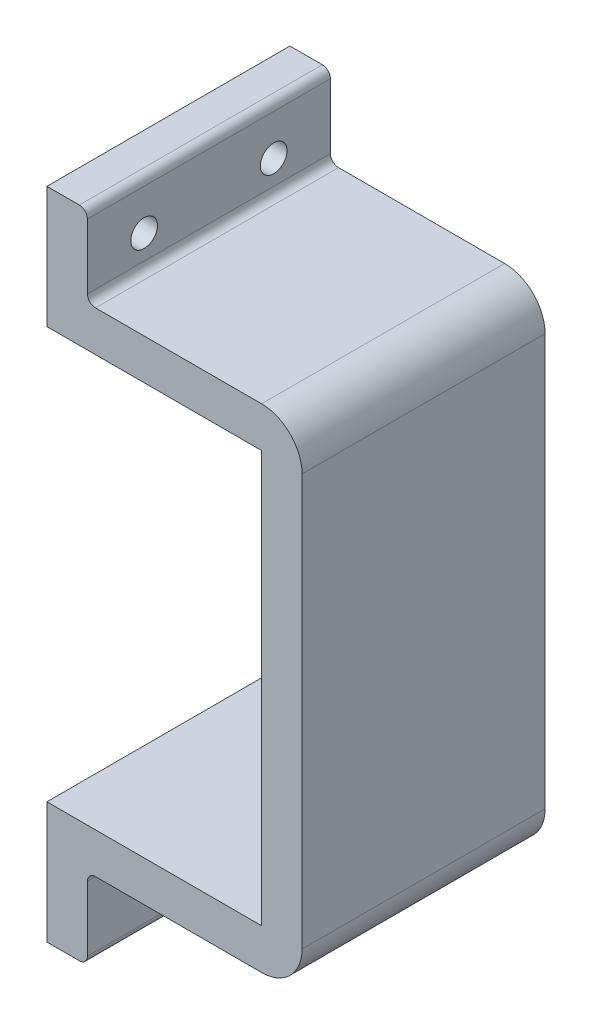
ISO-10303-21;
HEADER;
FILE_DESCRIPTION(('STEP AP214'),'2;1');
FILE_NAME('part.step','',(''),(''),'','','');
FILE_SCHEMA(('AUTOMOTIVE_DESIGN { 1 0 10303 214 1 1 1 1 }'));
ENDSEC;
DATA;
#1=APPLICATION_CONTEXT('core data for automotive mechanical design processes');
#2=APPLICATION_PROTOCOL_DEFINITION('international standard','automotive_design',2000,#1);
#3=PRODUCT_CONTEXT('',#1,'mechanical');
#4=PRODUCT('Part','Part','',(#3));
#5=PRODUCT_RELATED_PRODUCT_CATEGORY('part','',(#4));
#6=PRODUCT_DEFINITION_FORMATION('','',#4);
#7=PRODUCT_DEFINITION_CONTEXT('part definition',#1,'design');
#8=PRODUCT_DEFINITION('design','',#6,#7);
#9=PRODUCT_DEFINITION_SHAPE('','',#8);
#10=(LENGTH_UNIT() NAMED_UNIT(*) SI_UNIT(.MILLI.,.METRE.));
#11=(NAMED_UNIT(*) PLANE_ANGLE_UNIT() SI_UNIT($,.RADIAN.));
#12=(NAMED_UNIT(*) SI_UNIT($,.STERADIAN.) SOLID_ANGLE_UNIT());
#13=UNCERTAINTY_MEASURE_WITH_UNIT(LENGTH_MEASURE(1.E-05),#10,'distance_accuracy_value','');
#14=(GEOMETRIC_REPRESENTATION_CONTEXT(3) GLOBAL_UNCERTAINTY_ASSIGNED_CONTEXT((#13)) GLOBAL_UNIT_ASSIGNED_CONTEXT((#10,
#11,#12)) REPRESENTATION_CONTEXT('',''));
#15=CARTESIAN_POINT('',(0.,0.,0.));
#16=DIRECTION('',(0.,0.,1.));
#17=DIRECTION('',(1.,0.,0.));
#18=AXIS2_PLACEMENT_3D('',#15,#16,#17);
#19=CARTESIAN_POINT('',(-13.25,0.,30.));
#20=DIRECTION('',(-1.,0.,0.));
#21=DIRECTION('',(0.,0.,1.));
#22=AXIS2_PLACEMENT_3D('',#19,#20,#21);
#23=PLANE('',#22);
#24=CARTESIAN_POINT('',(-13.25,-34.4,7.));
#25=DIRECTION('',(-1.,0.,0.));
#26=DIRECTION('',(0.,0.,1.));
#27=AXIS2_PLACEMENT_3D('',#24,#25,#26);
#28=CIRCLE('',#27,1.65);
#29=CARTESIAN_POINT('',(-13.25,-34.4,8.65));
#30=VERTEX_POINT('',#29);
#31=EDGE_CURVE('E505',#30,#30,#28,.T.);
#32=ORIENTED_EDGE('',*,*,#31,.F.);
#33=EDGE_LOOP('',(#32));
#34=FACE_BOUND('',#33,.T.);
#35=CARTESIAN_POINT('',(-13.25,-34.4,23.));
#36=DIRECTION('',(-1.,0.,0.));
#37=DIRECTION('',(0.,0.,1.));
#38=AXIS2_PLACEMENT_3D('',#35,#36,#37);
#39=CIRCLE('',#38,1.65);
#40=CARTESIAN_POINT('',(-13.25,-34.4,24.65));
#41=VERTEX_POINT('',#40);
#42=EDGE_CURVE('E503',#41,#41,#39,.T.);
#43=ORIENTED_EDGE('',*,*,#42,.F.);
#44=EDGE_LOOP('',(#43));
#45=FACE_BOUND('',#44,.T.);
#46=DIRECTION('',(0.,1.,0.));
#47=VECTOR('',#46,1.);
#48=CARTESIAN_POINT('',(-13.25,0.,0.));
#49=LINE('',#48,#47);
#50=CARTESIAN_POINT('',(-13.25,-40.4,0.));
#51=VERTEX_POINT('',#50);
#52=CARTESIAN_POINT('',(-13.25,-25.4,0.));
#53=VERTEX_POINT('',#52);
#54=EDGE_CURVE('E188',#51,#53,#49,.T.);
#55=ORIENTED_EDGE('',*,*,#54,.F.);
#56=DIRECTION('',(0.,0.,-1.));
#57=VECTOR('',#56,1.);
#58=CARTESIAN_POINT('',(-13.25,-40.4,30.));
#59=LINE('',#58,#57);
#60=CARTESIAN_POINT('',(-13.25,-40.4,30.));
#61=VERTEX_POINT('',#60);
#62=EDGE_CURVE('E174',#61,#51,#59,.T.);
#63=ORIENTED_EDGE('',*,*,#62,.F.);
#64=DIRECTION('',(0.,1.,0.));
#65=VECTOR('',#64,1.);
#66=CARTESIAN_POINT('',(-13.25,0.,30.));
#67=LINE('',#66,#65);
#68=CARTESIAN_POINT('',(-13.25,-25.4,30.));
#69=VERTEX_POINT('',#68);
#70=EDGE_CURVE('E182',#61,#69,#67,.T.);
#71=ORIENTED_EDGE('',*,*,#70,.T.);
#72=DIRECTION('',(0.,0.,-1.));
#73=VECTOR('',#72,1.);
#74=CARTESIAN_POINT('',(-13.25,-25.4,30.));
#75=LINE('',#74,#73);
#76=EDGE_CURVE('E239',#69,#53,#75,.T.);
#77=ORIENTED_EDGE('',*,*,#76,.T.);
#78=EDGE_LOOP('',(#55,#63,#71,#77));
#79=FACE_BOUND('',#78,.T.);
#80=ADVANCED_FACE('F44',(#34,#45,#79),#23,.T.);
#81=CARTESIAN_POINT('',(0.,-40.4,30.));
#82=DIRECTION('',(0.,-1.,0.));
#83=DIRECTION('',(0.,0.,-1.));
#84=AXIS2_PLACEMENT_3D('',#81,#82,#83);
#85=PLANE('',#84);
#86=DIRECTION('',(-1.,0.,0.));
#87=VECTOR('',#86,1.);
#88=CARTESIAN_POINT('',(0.,-40.4,0.));
#89=LINE('',#88,#87);
#90=CARTESIAN_POINT('',(-9.24999999999999,-40.4,0.));
#91=VERTEX_POINT('',#90);
#92=EDGE_CURVE('E242',#91,#51,#89,.T.);
#93=ORIENTED_EDGE('',*,*,#92,.F.);
#94=DIRECTION('',(0.,0.,-1.));
#95=VECTOR('',#94,1.);
#96=CARTESIAN_POINT('',(-9.24999999999999,-40.4,30.));
#97=LINE('',#96,#95);
#98=CARTESIAN_POINT('',(-9.24999999999999,-40.4,30.));
#99=VERTEX_POINT('',#98);
#100=EDGE_CURVE('E177',#91,#99,#97,.F.);
#101=ORIENTED_EDGE('',*,*,#100,.T.);
#102=DIRECTION('',(-1.,0.,0.));
#103=VECTOR('',#102,1.);
#104=CARTESIAN_POINT('',(0.,-40.4,30.));
#105=LINE('',#104,#103);
#106=EDGE_CURVE('E170',#99,#61,#105,.T.);
#107=ORIENTED_EDGE('',*,*,#106,.T.);
#108=ORIENTED_EDGE('',*,*,#62,.T.);
#109=EDGE_LOOP('',(#93,#101,#107,#108));
#110=FACE_BOUND('',#109,.T.);
#111=ADVANCED_FACE('F173',(#110),#85,.T.);
#112=CARTESIAN_POINT('',(-8.25,0.,30.));
#113=DIRECTION('',(1.,0.,0.));
#114=DIRECTION('',(0.,1.,0.));
#115=AXIS2_PLACEMENT_3D('',#112,#113,#114);
#116=PLANE('',#115);
#117=CARTESIAN_POINT('',(-8.24999999999999,-34.4,7.));
#118=DIRECTION('',(1.,0.,0.));
#119=DIRECTION('',(0.,1.,0.));
#120=AXIS2_PLACEMENT_3D('',#117,#118,#119);
#121=CIRCLE('',#120,1.65);
#122=CARTESIAN_POINT('',(-8.24999999999999,-32.75,7.));
#123=VERTEX_POINT('',#122);
#124=EDGE_CURVE('E243',#123,#123,#121,.T.);
#125=ORIENTED_EDGE('',*,*,#124,.F.);
#126=EDGE_LOOP('',(#125));
#127=FACE_BOUND('',#126,.T.);
#128=CARTESIAN_POINT('',(-8.24999999999999,-34.4,23.));
#129=DIRECTION('',(1.,0.,0.));
#130=DIRECTION('',(0.,1.,0.));
#131=AXIS2_PLACEMENT_3D('',#128,#129,#130);
#132=CIRCLE('',#131,1.65);
#133=CARTESIAN_POINT('',(-8.24999999999999,-32.75,23.));
#134=VERTEX_POINT('',#133);
#135=EDGE_CURVE('E293',#134,#134,#132,.T.);
#136=ORIENTED_EDGE('',*,*,#135,.F.);
#137=EDGE_LOOP('',(#136));
#138=FACE_BOUND('',#137,.T.);
#139=DIRECTION('',(0.,-1.,0.));
#140=VECTOR('',#139,1.);
#141=CARTESIAN_POINT('',(-8.25,0.,0.));
#142=LINE('',#141,#140);
#143=CARTESIAN_POINT('',(-8.24999999999999,-31.4,0.));
#144=VERTEX_POINT('',#143);
#145=CARTESIAN_POINT('',(-8.24999999999999,-39.4,0.));
#146=VERTEX_POINT('',#145);
#147=EDGE_CURVE('E246',#144,#146,#142,.T.);
#148=ORIENTED_EDGE('',*,*,#147,.F.);
#149=DIRECTION('',(0.,0.,-1.));
#150=VECTOR('',#149,1.);
#151=CARTESIAN_POINT('',(-8.24999999999999,-31.4,30.));
#152=LINE('',#151,#150);
#153=CARTESIAN_POINT('',(-8.24999999999999,-31.4,30.));
#154=VERTEX_POINT('',#153);
#155=EDGE_CURVE('E334',#144,#154,#152,.F.);
#156=ORIENTED_EDGE('',*,*,#155,.T.);
#157=DIRECTION('',(0.,-1.,0.));
#158=VECTOR('',#157,1.);
#159=CARTESIAN_POINT('',(-8.25,0.,30.));
#160=LINE('',#159,#158);
#161=CARTESIAN_POINT('',(-8.24999999999999,-39.4,30.));
#162=VERTEX_POINT('',#161);
#163=EDGE_CURVE('E181',#154,#162,#160,.T.);
#164=ORIENTED_EDGE('',*,*,#163,.T.);
#165=DIRECTION('',(0.,0.,-1.));
#166=VECTOR('',#165,1.);
#167=CARTESIAN_POINT('',(-8.24999999999999,-39.4,30.));
#168=LINE('',#167,#166);
#169=EDGE_CURVE('E330',#162,#146,#168,.T.);
#170=ORIENTED_EDGE('',*,*,#169,.T.);
#171=EDGE_LOOP('',(#148,#156,#164,#170));
#172=FACE_BOUND('',#171,.T.);
#173=ADVANCED_FACE('F414',(#127,#138,#172),#116,.T.);
#174=CARTESIAN_POINT('',(0.,-30.4,30.));
#175=DIRECTION('',(0.,-1.,0.));
#176=DIRECTION('',(1.,0.,0.));
#177=AXIS2_PLACEMENT_3D('',#174,#175,#176);
#178=PLANE('',#177);
#179=DIRECTION('',(-1.,0.,0.));
#180=VECTOR('',#179,1.);
#181=CARTESIAN_POINT('',(0.,-30.4,30.));
#182=LINE('',#181,#180);
#183=CARTESIAN_POINT('',(13.25,-30.4,30.));
#184=VERTEX_POINT('',#183);
#185=CARTESIAN_POINT('',(-7.25,-30.4,30.));
#186=VERTEX_POINT('',#185);
#187=EDGE_CURVE('E210',#184,#186,#182,.T.);
#188=ORIENTED_EDGE('',*,*,#187,.T.);
#189=DIRECTION('',(0.,0.,-1.));
#190=VECTOR('',#189,1.);
#191=CARTESIAN_POINT('',(-7.25,-30.4,0.));
#192=LINE('',#191,#190);
#193=CARTESIAN_POINT('',(-7.25,-30.4,0.));
#194=VERTEX_POINT('',#193);
#195=EDGE_CURVE('E326',#186,#194,#192,.T.);
#196=ORIENTED_EDGE('',*,*,#195,.T.);
#197=DIRECTION('',(-1.,0.,0.));
#198=VECTOR('',#197,1.);
#199=CARTESIAN_POINT('',(0.,-30.4,0.));
#200=LINE('',#199,#198);
#201=CARTESIAN_POINT('',(13.25,-30.4,0.));
#202=VERTEX_POINT('',#201);
#203=EDGE_CURVE('E250',#202,#194,#200,.T.);
#204=ORIENTED_EDGE('',*,*,#203,.F.);
#205=DIRECTION('',(0.,0.,-1.));
#206=VECTOR('',#205,1.);
#207=CARTESIAN_POINT('',(13.25,-30.4,30.));
#208=LINE('',#207,#206);
#209=EDGE_CURVE('E312',#202,#184,#208,.F.);
#210=ORIENTED_EDGE('',*,*,#209,.T.);
#211=EDGE_LOOP('',(#188,#196,#204,#210));
#212=FACE_BOUND('',#211,.T.);
#213=ADVANCED_FACE('F422',(#212),#178,.T.);
#214=CARTESIAN_POINT('',(18.25,0.,30.));
#215=DIRECTION('',(1.,0.,0.));
#216=DIRECTION('',(0.,1.,0.));
#217=AXIS2_PLACEMENT_3D('',#214,#215,#216);
#218=PLANE('',#217);
#219=DIRECTION('',(0.,-1.,0.));
#220=VECTOR('',#219,1.);
#221=CARTESIAN_POINT('',(18.25,0.,30.));
#222=LINE('',#221,#220);
#223=CARTESIAN_POINT('',(18.25,25.4,30.));
#224=VERTEX_POINT('',#223);
#225=CARTESIAN_POINT('',(18.25,-25.4,30.));
#226=VERTEX_POINT('',#225);
#227=EDGE_CURVE('E214',#224,#226,#222,.T.);
#228=ORIENTED_EDGE('',*,*,#227,.T.);
#229=DIRECTION('',(0.,0.,-1.));
#230=VECTOR('',#229,1.);
#231=CARTESIAN_POINT('',(18.25,-25.4,30.));
#232=LINE('',#231,#230);
#233=CARTESIAN_POINT('',(18.25,-25.4,0.));
#234=VERTEX_POINT('',#233);
#235=EDGE_CURVE('E302',#226,#234,#232,.T.);
#236=ORIENTED_EDGE('',*,*,#235,.T.);
#237=DIRECTION('',(0.,-1.,0.));
#238=VECTOR('',#237,1.);
#239=CARTESIAN_POINT('',(18.25,0.,0.));
#240=LINE('',#239,#238);
#241=CARTESIAN_POINT('',(18.25,25.4,0.));
#242=VERTEX_POINT('',#241);
#243=EDGE_CURVE('E254',#242,#234,#240,.T.);
#244=ORIENTED_EDGE('',*,*,#243,.F.);
#245=DIRECTION('',(0.,0.,-1.));
#246=VECTOR('',#245,1.);
#247=CARTESIAN_POINT('',(18.25,25.4,30.));
#248=LINE('',#247,#246);
#249=EDGE_CURVE('E190',#242,#224,#248,.F.);
#250=ORIENTED_EDGE('',*,*,#249,.T.);
#251=EDGE_LOOP('',(#228,#236,#244,#250));
#252=FACE_BOUND('',#251,.T.);
#253=ADVANCED_FACE('F431',(#252),#218,.T.);
#254=CARTESIAN_POINT('',(0.,30.4,30.));
#255=DIRECTION('',(0.,1.,0.));
#256=DIRECTION('',(0.,0.,1.));
#257=AXIS2_PLACEMENT_3D('',#254,#255,#256);
#258=PLANE('',#257);
#259=DIRECTION('',(1.,0.,0.));
#260=VECTOR('',#259,1.);
#261=CARTESIAN_POINT('',(0.,30.4,0.));
#262=LINE('',#261,#260);
#263=CARTESIAN_POINT('',(-7.25,30.4,0.));
#264=VERTEX_POINT('',#263);
#265=CARTESIAN_POINT('',(13.25,30.4,0.));
#266=VERTEX_POINT('',#265);
#267=EDGE_CURVE('E258',#264,#266,#262,.T.);
#268=ORIENTED_EDGE('',*,*,#267,.F.);
#269=DIRECTION('',(0.,0.,-1.));
#270=VECTOR('',#269,1.);
#271=CARTESIAN_POINT('',(-7.25,30.4,30.));
#272=LINE('',#271,#270);
#273=CARTESIAN_POINT('',(-7.25,30.4,30.));
#274=VERTEX_POINT('',#273);
#275=EDGE_CURVE('E357',#264,#274,#272,.F.);
#276=ORIENTED_EDGE('',*,*,#275,.T.);
#277=DIRECTION('',(1.,0.,0.));
#278=VECTOR('',#277,1.);
#279=CARTESIAN_POINT('',(0.,30.4,30.));
#280=LINE('',#279,#278);
#281=CARTESIAN_POINT('',(13.25,30.4,30.));
#282=VERTEX_POINT('',#281);
#283=EDGE_CURVE('E218',#274,#282,#280,.T.);
#284=ORIENTED_EDGE('',*,*,#283,.T.);
#285=DIRECTION('',(0.,0.,-1.));
#286=VECTOR('',#285,1.);
#287=CARTESIAN_POINT('',(13.25,30.4,30.));
#288=LINE('',#287,#286);
#289=EDGE_CURVE('E322',#282,#266,#288,.T.);
#290=ORIENTED_EDGE('',*,*,#289,.T.);
#291=EDGE_LOOP('',(#268,#276,#284,#290));
#292=FACE_BOUND('',#291,.T.);
#293=ADVANCED_FACE('F379',(#292),#258,.T.);
#294=CARTESIAN_POINT('',(-8.24999999999999,0.,30.));
#295=DIRECTION('',(1.,0.,0.));
#296=DIRECTION('',(0.,1.,0.));
#297=AXIS2_PLACEMENT_3D('',#294,#295,#296);
#298=PLANE('',#297);
#299=CARTESIAN_POINT('',(-8.25,34.4,23.));
#300=DIRECTION('',(1.,0.,0.));
#301=DIRECTION('',(0.,1.,0.));
#302=AXIS2_PLACEMENT_3D('',#299,#300,#301);
#303=CIRCLE('',#302,1.65);
#304=CARTESIAN_POINT('',(-8.25,36.05,23.));
#305=VERTEX_POINT('',#304);
#306=EDGE_CURVE('E204',#305,#305,#303,.T.);
#307=ORIENTED_EDGE('',*,*,#306,.F.);
#308=EDGE_LOOP('',(#307));
#309=FACE_BOUND('',#308,.T.);
#310=CARTESIAN_POINT('',(-8.25,34.4,7.));
#311=DIRECTION('',(1.,0.,0.));
#312=DIRECTION('',(0.,1.,0.));
#313=AXIS2_PLACEMENT_3D('',#310,#311,#312);
#314=CIRCLE('',#313,1.65);
#315=CARTESIAN_POINT('',(-8.25,36.05,7.));
#316=VERTEX_POINT('',#315);
#317=EDGE_CURVE('E518',#316,#316,#314,.T.);
#318=ORIENTED_EDGE('',*,*,#317,.F.);
#319=EDGE_LOOP('',(#318));
#320=FACE_BOUND('',#319,.T.);
#321=DIRECTION('',(0.,-1.,0.));
#322=VECTOR('',#321,1.);
#323=CARTESIAN_POINT('',(-8.24999999999999,0.,30.));
#324=LINE('',#323,#322);
#325=CARTESIAN_POINT('',(-8.25,39.4,30.));
#326=VERTEX_POINT('',#325);
#327=CARTESIAN_POINT('',(-8.25,31.4,30.));
#328=VERTEX_POINT('',#327);
#329=EDGE_CURVE('E221',#326,#328,#324,.T.);
#330=ORIENTED_EDGE('',*,*,#329,.T.);
#331=DIRECTION('',(0.,0.,-1.));
#332=VECTOR('',#331,1.);
#333=CARTESIAN_POINT('',(-8.25,31.4,0.));
#334=LINE('',#333,#332);
#335=CARTESIAN_POINT('',(-8.25,31.4,0.));
#336=VERTEX_POINT('',#335);
#337=EDGE_CURVE('E353',#328,#336,#334,.T.);
#338=ORIENTED_EDGE('',*,*,#337,.T.);
#339=DIRECTION('',(0.,-1.,0.));
#340=VECTOR('',#339,1.);
#341=CARTESIAN_POINT('',(-8.24999999999999,0.,0.));
#342=LINE('',#341,#340);
#343=CARTESIAN_POINT('',(-8.25,39.4,0.));
#344=VERTEX_POINT('',#343);
#345=EDGE_CURVE('E261',#344,#336,#342,.T.);
#346=ORIENTED_EDGE('',*,*,#345,.F.);
#347=DIRECTION('',(0.,0.,-1.));
#348=VECTOR('',#347,1.);
#349=CARTESIAN_POINT('',(-8.25,39.4,30.));
#350=LINE('',#349,#348);
#351=EDGE_CURVE('E350',#344,#326,#350,.F.);
#352=ORIENTED_EDGE('',*,*,#351,.T.);
#353=EDGE_LOOP('',(#330,#338,#346,#352));
#354=FACE_BOUND('',#353,.T.);
#355=ADVANCED_FACE('F383',(#309,#320,#354),#298,.T.);
#356=CARTESIAN_POINT('',(0.,40.4,30.));
#357=DIRECTION('',(0.,1.,0.));
#358=DIRECTION('',(0.,0.,1.));
#359=AXIS2_PLACEMENT_3D('',#356,#357,#358);
#360=PLANE('',#359);
#361=DIRECTION('',(1.,0.,0.));
#362=VECTOR('',#361,1.);
#363=CARTESIAN_POINT('',(0.,40.4,30.));
#364=LINE('',#363,#362);
#365=CARTESIAN_POINT('',(-13.25,40.4,30.));
#366=VERTEX_POINT('',#365);
#367=CARTESIAN_POINT('',(-9.25,40.4,30.));
#368=VERTEX_POINT('',#367);
#369=EDGE_CURVE('E224',#366,#368,#364,.T.);
#370=ORIENTED_EDGE('',*,*,#369,.T.);
#371=DIRECTION('',(0.,0.,-1.));
#372=VECTOR('',#371,1.);
#373=CARTESIAN_POINT('',(-9.25,40.4,30.));
#374=LINE('',#373,#372);
#375=CARTESIAN_POINT('',(-9.25,40.4,0.));
#376=VERTEX_POINT('',#375);
#377=EDGE_CURVE('E360',#368,#376,#374,.T.);
#378=ORIENTED_EDGE('',*,*,#377,.T.);
#379=DIRECTION('',(1.,0.,0.));
#380=VECTOR('',#379,1.);
#381=CARTESIAN_POINT('',(0.,40.4,0.));
#382=LINE('',#381,#380);
#383=CARTESIAN_POINT('',(-13.25,40.4,0.));
#384=VERTEX_POINT('',#383);
#385=EDGE_CURVE('E265',#384,#376,#382,.T.);
#386=ORIENTED_EDGE('',*,*,#385,.F.);
#387=DIRECTION('',(0.,0.,-1.));
#388=VECTOR('',#387,1.);
#389=CARTESIAN_POINT('',(-13.25,40.4,30.));
#390=LINE('',#389,#388);
#391=EDGE_CURVE('E191',#366,#384,#390,.T.);
#392=ORIENTED_EDGE('',*,*,#391,.F.);
#393=EDGE_LOOP('',(#370,#378,#386,#392));
#394=FACE_BOUND('',#393,.T.);
#395=ADVANCED_FACE('F389',(#394),#360,.T.);
#396=CARTESIAN_POINT('',(-13.25,0.,30.));
#397=DIRECTION('',(-1.,0.,0.));
#398=DIRECTION('',(0.,0.,1.));
#399=AXIS2_PLACEMENT_3D('',#396,#397,#398);
#400=PLANE('',#399);
#401=CARTESIAN_POINT('',(-13.25,34.4,23.));
#402=DIRECTION('',(-1.,0.,0.));
#403=DIRECTION('',(0.,0.,1.));
#404=AXIS2_PLACEMENT_3D('',#401,#402,#403);
#405=CIRCLE('',#404,1.65);
#406=CARTESIAN_POINT('',(-13.25,34.4,24.65));
#407=VERTEX_POINT('',#406);
#408=EDGE_CURVE('E509',#407,#407,#405,.T.);
#409=ORIENTED_EDGE('',*,*,#408,.F.);
#410=EDGE_LOOP('',(#409));
#411=FACE_BOUND('',#410,.T.);
#412=CARTESIAN_POINT('',(-13.25,34.4,7.));
#413=DIRECTION('',(-1.,0.,0.));
#414=DIRECTION('',(0.,0.,1.));
#415=AXIS2_PLACEMENT_3D('',#412,#413,#414);
#416=CIRCLE('',#415,1.65);
#417=CARTESIAN_POINT('',(-13.25,34.4,8.65));
#418=VERTEX_POINT('',#417);
#419=EDGE_CURVE('E514',#418,#418,#416,.T.);
#420=ORIENTED_EDGE('',*,*,#419,.F.);
#421=EDGE_LOOP('',(#420));
#422=FACE_BOUND('',#421,.T.);
#423=DIRECTION('',(0.,1.,0.));
#424=VECTOR('',#423,1.);
#425=CARTESIAN_POINT('',(-13.25,0.,0.));
#426=LINE('',#425,#424);
#427=CARTESIAN_POINT('',(-13.25,25.4,0.));
#428=VERTEX_POINT('',#427);
#429=EDGE_CURVE('E269',#428,#384,#426,.T.);
#430=ORIENTED_EDGE('',*,*,#429,.F.);
#431=DIRECTION('',(0.,0.,-1.));
#432=VECTOR('',#431,1.);
#433=CARTESIAN_POINT('',(-13.25,25.4,30.));
#434=LINE('',#433,#432);
#435=CARTESIAN_POINT('',(-13.25,25.4,30.));
#436=VERTEX_POINT('',#435);
#437=EDGE_CURVE('E288',#436,#428,#434,.T.);
#438=ORIENTED_EDGE('',*,*,#437,.F.);
#439=DIRECTION('',(0.,1.,0.));
#440=VECTOR('',#439,1.);
#441=CARTESIAN_POINT('',(-13.25,0.,30.));
#442=LINE('',#441,#440);
#443=EDGE_CURVE('E227',#436,#366,#442,.T.);
#444=ORIENTED_EDGE('',*,*,#443,.T.);
#445=ORIENTED_EDGE('',*,*,#391,.T.);
#446=EDGE_LOOP('',(#430,#438,#444,#445));
#447=FACE_BOUND('',#446,.T.);
#448=ADVANCED_FACE('F394',(#411,#422,#447),#400,.T.);
#449=CARTESIAN_POINT('',(0.,25.4,30.));
#450=DIRECTION('',(0.,1.,0.));
#451=DIRECTION('',(0.,0.,1.));
#452=AXIS2_PLACEMENT_3D('',#449,#450,#451);
#453=PLANE('',#452);
#454=DIRECTION('',(1.,0.,0.));
#455=VECTOR('',#454,1.);
#456=CARTESIAN_POINT('',(0.,25.4,0.));
#457=LINE('',#456,#455);
#458=CARTESIAN_POINT('',(13.25,25.4,0.));
#459=VERTEX_POINT('',#458);
#460=EDGE_CURVE('E273',#428,#459,#457,.T.);
#461=ORIENTED_EDGE('',*,*,#460,.T.);
#462=DIRECTION('',(0.,0.,-1.));
#463=VECTOR('',#462,1.);
#464=CARTESIAN_POINT('',(13.25,25.4,30.));
#465=LINE('',#464,#463);
#466=CARTESIAN_POINT('',(13.25,25.4,30.));
#467=VERTEX_POINT('',#466);
#468=EDGE_CURVE('E284',#467,#459,#465,.T.);
#469=ORIENTED_EDGE('',*,*,#468,.F.);
#470=DIRECTION('',(1.,0.,0.));
#471=VECTOR('',#470,1.);
#472=CARTESIAN_POINT('',(0.,25.4,30.));
#473=LINE('',#472,#471);
#474=EDGE_CURVE('E231',#436,#467,#473,.T.);
#475=ORIENTED_EDGE('',*,*,#474,.F.);
#476=ORIENTED_EDGE('',*,*,#437,.T.);
#477=EDGE_LOOP('',(#461,#469,#475,#476));
#478=FACE_BOUND('',#477,.T.);
#479=ADVANCED_FACE('F401',(#478),#453,.F.);
#480=CARTESIAN_POINT('',(13.25,0.,30.));
#481=DIRECTION('',(1.,0.,0.));
#482=DIRECTION('',(0.,1.,0.));
#483=AXIS2_PLACEMENT_3D('',#480,#481,#482);
#484=PLANE('',#483);
#485=DIRECTION('',(0.,-1.,0.));
#486=VECTOR('',#485,1.);
#487=CARTESIAN_POINT('',(13.25,0.,0.));
#488=LINE('',#487,#486);
#489=CARTESIAN_POINT('',(13.25,-25.4,0.));
#490=VERTEX_POINT('',#489);
#491=EDGE_CURVE('E201',#459,#490,#488,.T.);
#492=ORIENTED_EDGE('',*,*,#491,.T.);
#493=DIRECTION('',(0.,0.,-1.));
#494=VECTOR('',#493,1.);
#495=CARTESIAN_POINT('',(13.25,-25.4,30.));
#496=LINE('',#495,#494);
#497=CARTESIAN_POINT('',(13.25,-25.4,30.));
#498=VERTEX_POINT('',#497);
#499=EDGE_CURVE('E281',#498,#490,#496,.T.);
#500=ORIENTED_EDGE('',*,*,#499,.F.);
#501=DIRECTION('',(0.,-1.,0.));
#502=VECTOR('',#501,1.);
#503=CARTESIAN_POINT('',(13.25,0.,30.));
#504=LINE('',#503,#502);
#505=EDGE_CURVE('E234',#467,#498,#504,.T.);
#506=ORIENTED_EDGE('',*,*,#505,.F.);
#507=ORIENTED_EDGE('',*,*,#468,.T.);
#508=EDGE_LOOP('',(#492,#500,#506,#507));
#509=FACE_BOUND('',#508,.T.);
#510=ADVANCED_FACE('F403',(#509),#484,.F.);
#511=CARTESIAN_POINT('',(0.,-25.4,30.));
#512=DIRECTION('',(0.,1.,0.));
#513=DIRECTION('',(0.,0.,1.));
#514=AXIS2_PLACEMENT_3D('',#511,#512,#513);
#515=PLANE('',#514);
#516=DIRECTION('',(1.,0.,0.));
#517=VECTOR('',#516,1.);
#518=CARTESIAN_POINT('',(0.,-25.4,0.));
#519=LINE('',#518,#517);
#520=EDGE_CURVE('E197',#53,#490,#519,.T.);
#521=ORIENTED_EDGE('',*,*,#520,.F.);
#522=ORIENTED_EDGE('',*,*,#76,.F.);
#523=DIRECTION('',(1.,0.,0.));
#524=VECTOR('',#523,1.);
#525=CARTESIAN_POINT('',(0.,-25.4,30.));
#526=LINE('',#525,#524);
#527=EDGE_CURVE('E195',#69,#498,#526,.T.);
#528=ORIENTED_EDGE('',*,*,#527,.T.);
#529=ORIENTED_EDGE('',*,*,#499,.T.);
#530=EDGE_LOOP('',(#521,#522,#528,#529));
#531=FACE_BOUND('',#530,.T.);
#532=ADVANCED_FACE('F406',(#531),#515,.T.);
#533=CARTESIAN_POINT('',(0.,0.,30.));
#534=DIRECTION('',(0.,0.,1.));
#535=DIRECTION('',(1.,0.,0.));
#536=AXIS2_PLACEMENT_3D('',#533,#534,#535);
#537=PLANE('',#536);
#538=ORIENTED_EDGE('',*,*,#106,.F.);
#539=CARTESIAN_POINT('',(-9.24999999999999,-39.4,30.));
#540=DIRECTION('',(0.,0.,1.));
#541=DIRECTION('',(1.,0.,0.));
#542=AXIS2_PLACEMENT_3D('',#539,#540,#541);
#543=CIRCLE('',#542,1.);
#544=EDGE_CURVE('E347',#99,#162,#543,.T.);
#545=ORIENTED_EDGE('',*,*,#544,.T.);
#546=ORIENTED_EDGE('',*,*,#163,.F.);
#547=CARTESIAN_POINT('',(-7.25,-31.4,30.));
#548=DIRECTION('',(0.,0.,1.));
#549=DIRECTION('',(1.,0.,0.));
#550=AXIS2_PLACEMENT_3D('',#547,#548,#549);
#551=CIRCLE('',#550,1.);
#552=EDGE_CURVE('E367',#154,#186,#551,.F.);
#553=ORIENTED_EDGE('',*,*,#552,.T.);
#554=ORIENTED_EDGE('',*,*,#187,.F.);
#555=CARTESIAN_POINT('',(13.25,-25.4,30.));
#556=DIRECTION('',(0.,0.,1.));
#557=DIRECTION('',(1.,0.,0.));
#558=AXIS2_PLACEMENT_3D('',#555,#556,#557);
#559=CIRCLE('',#558,5.);
#560=EDGE_CURVE('E319',#184,#226,#559,.T.);
#561=ORIENTED_EDGE('',*,*,#560,.T.);
#562=ORIENTED_EDGE('',*,*,#227,.F.);
#563=CARTESIAN_POINT('',(13.25,25.4,30.));
#564=DIRECTION('',(0.,0.,1.));
#565=DIRECTION('',(1.,0.,0.));
#566=AXIS2_PLACEMENT_3D('',#563,#564,#565);
#567=CIRCLE('',#566,5.);
#568=EDGE_CURVE('E315',#224,#282,#567,.T.);
#569=ORIENTED_EDGE('',*,*,#568,.T.);
#570=ORIENTED_EDGE('',*,*,#283,.F.);
#571=CARTESIAN_POINT('',(-7.25,31.4,30.));
#572=DIRECTION('',(0.,0.,1.));
#573=DIRECTION('',(1.,0.,0.));
#574=AXIS2_PLACEMENT_3D('',#571,#572,#573);
#575=CIRCLE('',#574,1.);
#576=EDGE_CURVE('E11',#274,#328,#575,.F.);
#577=ORIENTED_EDGE('',*,*,#576,.T.);
#578=ORIENTED_EDGE('',*,*,#329,.F.);
#579=CARTESIAN_POINT('',(-9.25,39.4,30.));
#580=DIRECTION('',(0.,0.,1.));
#581=DIRECTION('',(1.,0.,0.));
#582=AXIS2_PLACEMENT_3D('',#579,#580,#581);
#583=CIRCLE('',#582,1.);
#584=EDGE_CURVE('E60',#326,#368,#583,.T.);
#585=ORIENTED_EDGE('',*,*,#584,.T.);
#586=ORIENTED_EDGE('',*,*,#369,.F.);
#587=ORIENTED_EDGE('',*,*,#443,.F.);
#588=ORIENTED_EDGE('',*,*,#474,.T.);
#589=ORIENTED_EDGE('',*,*,#505,.T.);
#590=ORIENTED_EDGE('',*,*,#527,.F.);
#591=ORIENTED_EDGE('',*,*,#70,.F.);
#592=EDGE_LOOP('',(#538,#545,#546,#553,#554,#561,#562,#569,#570,#577,#578,#585,#586,#587,#588,
#589,#590,#591));
#593=FACE_BOUND('',#592,.T.);
#594=ADVANCED_FACE('F193',(#593),#537,.T.);
#595=CARTESIAN_POINT('',(0.,0.,0.));
#596=DIRECTION('',(0.,0.,1.));
#597=DIRECTION('',(1.,0.,0.));
#598=AXIS2_PLACEMENT_3D('',#595,#596,#597);
#599=PLANE('',#598);
#600=ORIENTED_EDGE('',*,*,#147,.T.);
#601=CARTESIAN_POINT('',(-9.24999999999999,-39.4,0.));
#602=DIRECTION('',(0.,0.,1.));
#603=DIRECTION('',(1.,0.,0.));
#604=AXIS2_PLACEMENT_3D('',#601,#602,#603);
#605=CIRCLE('',#604,1.);
#606=EDGE_CURVE('E340',#146,#91,#605,.F.);
#607=ORIENTED_EDGE('',*,*,#606,.T.);
#608=ORIENTED_EDGE('',*,*,#92,.T.);
#609=ORIENTED_EDGE('',*,*,#54,.T.);
#610=ORIENTED_EDGE('',*,*,#520,.T.);
#611=ORIENTED_EDGE('',*,*,#491,.F.);
#612=ORIENTED_EDGE('',*,*,#460,.F.);
#613=ORIENTED_EDGE('',*,*,#429,.T.);
#614=ORIENTED_EDGE('',*,*,#385,.T.);
#615=CARTESIAN_POINT('',(-9.25,39.4,0.));
#616=DIRECTION('',(0.,0.,1.));
#617=DIRECTION('',(1.,0.,0.));
#618=AXIS2_PLACEMENT_3D('',#615,#616,#617);
#619=CIRCLE('',#618,1.);
#620=EDGE_CURVE('E337',#376,#344,#619,.F.);
#621=ORIENTED_EDGE('',*,*,#620,.T.);
#622=ORIENTED_EDGE('',*,*,#345,.T.);
#623=CARTESIAN_POINT('',(-7.25,31.4,0.));
#624=DIRECTION('',(0.,0.,1.));
#625=DIRECTION('',(1.,0.,0.));
#626=AXIS2_PLACEMENT_3D('',#623,#624,#625);
#627=CIRCLE('',#626,1.);
#628=EDGE_CURVE('E53',#336,#264,#627,.T.);
#629=ORIENTED_EDGE('',*,*,#628,.T.);
#630=ORIENTED_EDGE('',*,*,#267,.T.);
#631=CARTESIAN_POINT('',(13.25,25.4,0.));
#632=DIRECTION('',(0.,0.,1.));
#633=DIRECTION('',(1.,0.,0.));
#634=AXIS2_PLACEMENT_3D('',#631,#632,#633);
#635=CIRCLE('',#634,5.);
#636=EDGE_CURVE('E306',#266,#242,#635,.F.);
#637=ORIENTED_EDGE('',*,*,#636,.T.);
#638=ORIENTED_EDGE('',*,*,#243,.T.);
#639=CARTESIAN_POINT('',(13.25,-25.4,0.));
#640=DIRECTION('',(0.,0.,1.));
#641=DIRECTION('',(1.,0.,0.));
#642=AXIS2_PLACEMENT_3D('',#639,#640,#641);
#643=CIRCLE('',#642,5.);
#644=EDGE_CURVE('E309',#234,#202,#643,.F.);
#645=ORIENTED_EDGE('',*,*,#644,.T.);
#646=ORIENTED_EDGE('',*,*,#203,.T.);
#647=CARTESIAN_POINT('',(-7.25,-31.4,0.));
#648=DIRECTION('',(0.,0.,1.));
#649=DIRECTION('',(1.,0.,0.));
#650=AXIS2_PLACEMENT_3D('',#647,#648,#649);
#651=CIRCLE('',#650,1.);
#652=EDGE_CURVE('E364',#194,#144,#651,.T.);
#653=ORIENTED_EDGE('',*,*,#652,.T.);
#654=EDGE_LOOP('',(#600,#607,#608,#609,#610,#611,#612,#613,#614,#621,#622,#629,#630,#637,#638,
#645,#646,#653));
#655=FACE_BOUND('',#654,.T.);
#656=ADVANCED_FACE('F372',(#655),#599,.F.);
#657=CARTESIAN_POINT('',(16.75,34.4,7.));
#658=DIRECTION('',(-1.,0.,0.));
#659=DIRECTION('',(0.,0.,1.));
#660=AXIS2_PLACEMENT_3D('',#657,#658,#659);
#661=CYLINDRICAL_SURFACE('',#660,1.65);
#662=ORIENTED_EDGE('',*,*,#317,.T.);
#663=EDGE_LOOP('',(#662));
#664=FACE_BOUND('',#663,.T.);
#665=ORIENTED_EDGE('',*,*,#419,.T.);
#666=EDGE_LOOP('',(#665));
#667=FACE_BOUND('',#666,.T.);
#668=ADVANCED_FACE('F481',(#664,#667),#661,.F.);
#669=CARTESIAN_POINT('',(16.75,34.4,23.));
#670=DIRECTION('',(-1.,0.,0.));
#671=DIRECTION('',(0.,0.,1.));
#672=AXIS2_PLACEMENT_3D('',#669,#670,#671);
#673=CYLINDRICAL_SURFACE('',#672,1.65);
#674=ORIENTED_EDGE('',*,*,#306,.T.);
#675=EDGE_LOOP('',(#674));
#676=FACE_BOUND('',#675,.T.);
#677=ORIENTED_EDGE('',*,*,#408,.T.);
#678=EDGE_LOOP('',(#677));
#679=FACE_BOUND('',#678,.T.);
#680=ADVANCED_FACE('F486',(#676,#679),#673,.F.);
#681=CARTESIAN_POINT('',(16.75,-34.4,23.));
#682=DIRECTION('',(-1.,0.,0.));
#683=DIRECTION('',(0.,0.,1.));
#684=AXIS2_PLACEMENT_3D('',#681,#682,#683);
#685=CYLINDRICAL_SURFACE('',#684,1.65);
#686=ORIENTED_EDGE('',*,*,#135,.T.);
#687=EDGE_LOOP('',(#686));
#688=FACE_BOUND('',#687,.T.);
#689=ORIENTED_EDGE('',*,*,#42,.T.);
#690=EDGE_LOOP('',(#689));
#691=FACE_BOUND('',#690,.T.);
#692=ADVANCED_FACE('F490',(#688,#691),#685,.F.);
#693=CARTESIAN_POINT('',(16.75,-34.4,7.));
#694=DIRECTION('',(-1.,0.,0.));
#695=DIRECTION('',(0.,0.,1.));
#696=AXIS2_PLACEMENT_3D('',#693,#694,#695);
#697=CYLINDRICAL_SURFACE('',#696,1.65);
#698=ORIENTED_EDGE('',*,*,#124,.T.);
#699=EDGE_LOOP('',(#698));
#700=FACE_BOUND('',#699,.T.);
#701=ORIENTED_EDGE('',*,*,#31,.T.);
#702=EDGE_LOOP('',(#701));
#703=FACE_BOUND('',#702,.T.);
#704=ADVANCED_FACE('F443',(#700,#703),#697,.F.);
#705=CARTESIAN_POINT('',(13.25,-25.4,30.));
#706=DIRECTION('',(0.,0.,-1.));
#707=DIRECTION('',(-1.,0.,0.));
#708=AXIS2_PLACEMENT_3D('',#705,#706,#707);
#709=CYLINDRICAL_SURFACE('',#708,5.);
#710=ORIENTED_EDGE('',*,*,#560,.F.);
#711=ORIENTED_EDGE('',*,*,#209,.F.);
#712=ORIENTED_EDGE('',*,*,#644,.F.);
#713=ORIENTED_EDGE('',*,*,#235,.F.);
#714=EDGE_LOOP('',(#710,#711,#712,#713));
#715=FACE_BOUND('',#714,.T.);
#716=ADVANCED_FACE('F426',(#715),#709,.T.);
#717=CARTESIAN_POINT('',(13.25,25.4,30.));
#718=DIRECTION('',(0.,0.,-1.));
#719=DIRECTION('',(-1.,0.,0.));
#720=AXIS2_PLACEMENT_3D('',#717,#718,#719);
#721=CYLINDRICAL_SURFACE('',#720,5.);
#722=ORIENTED_EDGE('',*,*,#568,.F.);
#723=ORIENTED_EDGE('',*,*,#249,.F.);
#724=ORIENTED_EDGE('',*,*,#636,.F.);
#725=ORIENTED_EDGE('',*,*,#289,.F.);
#726=EDGE_LOOP('',(#722,#723,#724,#725));
#727=FACE_BOUND('',#726,.T.);
#728=ADVANCED_FACE('F435',(#727),#721,.T.);
#729=CARTESIAN_POINT('',(-7.25,-31.4,30.));
#730=DIRECTION('',(0.,0.,1.));
#731=DIRECTION('',(1.,0.,0.));
#732=AXIS2_PLACEMENT_3D('',#729,#730,#731);
#733=CYLINDRICAL_SURFACE('',#732,1.);
#734=ORIENTED_EDGE('',*,*,#552,.F.);
#735=ORIENTED_EDGE('',*,*,#155,.F.);
#736=ORIENTED_EDGE('',*,*,#652,.F.);
#737=ORIENTED_EDGE('',*,*,#195,.F.);
#738=EDGE_LOOP('',(#734,#735,#736,#737));
#739=FACE_BOUND('',#738,.T.);
#740=ADVANCED_FACE('F417',(#739),#733,.F.);
#741=CARTESIAN_POINT('',(-9.24999999999999,-39.4,30.));
#742=DIRECTION('',(0.,0.,-1.));
#743=DIRECTION('',(-1.,0.,0.));
#744=AXIS2_PLACEMENT_3D('',#741,#742,#743);
#745=CYLINDRICAL_SURFACE('',#744,1.);
#746=ORIENTED_EDGE('',*,*,#544,.F.);
#747=ORIENTED_EDGE('',*,*,#100,.F.);
#748=ORIENTED_EDGE('',*,*,#606,.F.);
#749=ORIENTED_EDGE('',*,*,#169,.F.);
#750=EDGE_LOOP('',(#746,#747,#748,#749));
#751=FACE_BOUND('',#750,.T.);
#752=ADVANCED_FACE('F408',(#751),#745,.T.);
#753=CARTESIAN_POINT('',(-7.25,31.4,30.));
#754=DIRECTION('',(0.,0.,1.));
#755=DIRECTION('',(1.,0.,0.));
#756=AXIS2_PLACEMENT_3D('',#753,#754,#755);
#757=CYLINDRICAL_SURFACE('',#756,1.);
#758=ORIENTED_EDGE('',*,*,#576,.F.);
#759=ORIENTED_EDGE('',*,*,#275,.F.);
#760=ORIENTED_EDGE('',*,*,#628,.F.);
#761=ORIENTED_EDGE('',*,*,#337,.F.);
#762=EDGE_LOOP('',(#758,#759,#760,#761));
#763=FACE_BOUND('',#762,.T.);
#764=ADVANCED_FACE('F381',(#763),#757,.F.);
#765=CARTESIAN_POINT('',(-9.25,39.4,30.));
#766=DIRECTION('',(0.,0.,-1.));
#767=DIRECTION('',(-1.,0.,0.));
#768=AXIS2_PLACEMENT_3D('',#765,#766,#767);
#769=CYLINDRICAL_SURFACE('',#768,1.);
#770=ORIENTED_EDGE('',*,*,#584,.F.);
#771=ORIENTED_EDGE('',*,*,#351,.F.);
#772=ORIENTED_EDGE('',*,*,#620,.F.);
#773=ORIENTED_EDGE('',*,*,#377,.F.);
#774=EDGE_LOOP('',(#770,#771,#772,#773));
#775=FACE_BOUND('',#774,.T.);
#776=ADVANCED_FACE('F46',(#775),#769,.T.);
#777=CLOSED_SHELL('',(#80,#111,#173,#213,#253,#293,#355,#395,#448,#479,#510,#532,#594,#656,#668,
#680,#692,#704,#716,#728,#740,#752,#764,#776));
#778=MANIFOLD_SOLID_BREP('B2',#777);
#779=ADVANCED_BREP_SHAPE_REPRESENTATION('',(#18,#778),#14);
#780=SHAPE_DEFINITION_REPRESENTATION(#9,#779);
ENDSEC;
END-ISO-10303-21;
